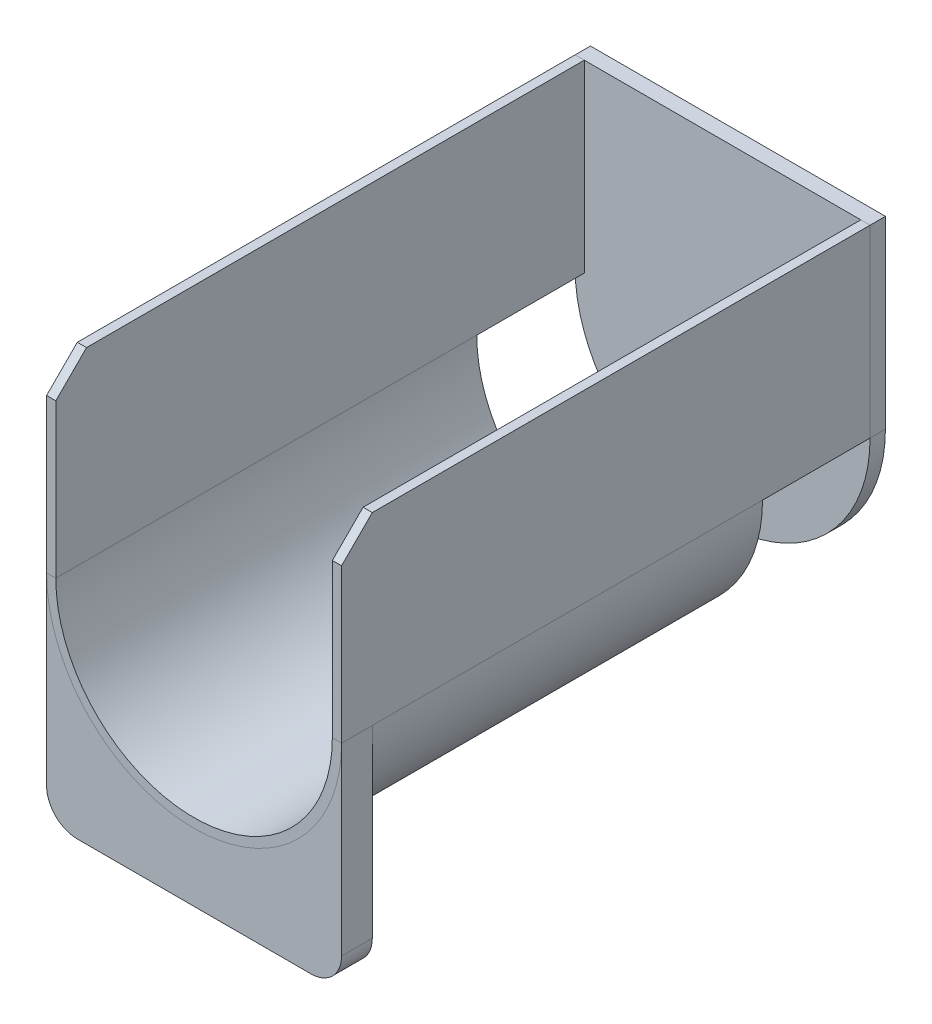
ISO-10303-21;
HEADER;
FILE_DESCRIPTION(('STEP AP214'),'2;1');
FILE_NAME('part.step','',(''),(''),'','','');
FILE_SCHEMA(('AUTOMOTIVE_DESIGN { 1 0 10303 214 1 1 1 1 }'));
ENDSEC;
DATA;
#1=APPLICATION_CONTEXT('core data for automotive mechanical design processes');
#2=APPLICATION_PROTOCOL_DEFINITION('international standard','automotive_design',2000,#1);
#3=PRODUCT_CONTEXT('',#1,'mechanical');
#4=PRODUCT('Part','Part','',(#3));
#5=PRODUCT_RELATED_PRODUCT_CATEGORY('part','',(#4));
#6=PRODUCT_DEFINITION_FORMATION('','',#4);
#7=PRODUCT_DEFINITION_CONTEXT('part definition',#1,'design');
#8=PRODUCT_DEFINITION('design','',#6,#7);
#9=PRODUCT_DEFINITION_SHAPE('','',#8);
#10=(LENGTH_UNIT() NAMED_UNIT(*) SI_UNIT(.MILLI.,.METRE.));
#11=(NAMED_UNIT(*) PLANE_ANGLE_UNIT() SI_UNIT($,.RADIAN.));
#12=(NAMED_UNIT(*) SI_UNIT($,.STERADIAN.) SOLID_ANGLE_UNIT());
#13=UNCERTAINTY_MEASURE_WITH_UNIT(LENGTH_MEASURE(1.E-05),#10,'distance_accuracy_value','');
#14=(GEOMETRIC_REPRESENTATION_CONTEXT(3) GLOBAL_UNCERTAINTY_ASSIGNED_CONTEXT((#13)) GLOBAL_UNIT_ASSIGNED_CONTEXT((#10,
#11,#12)) REPRESENTATION_CONTEXT('',''));
#15=CARTESIAN_POINT('',(0.,0.,0.));
#16=DIRECTION('',(0.,0.,1.));
#17=DIRECTION('',(1.,0.,0.));
#18=AXIS2_PLACEMENT_3D('',#15,#16,#17);
#19=CARTESIAN_POINT('',(0.,-70.,162.));
#20=DIRECTION('',(0.,-1.,0.));
#21=DIRECTION('',(0.,0.,-1.));
#22=AXIS2_PLACEMENT_3D('',#19,#20,#21);
#23=PLANE('',#22);
#24=DIRECTION('',(1.,0.,0.));
#25=VECTOR('',#24,1.);
#26=CARTESIAN_POINT('',(0.,-70.,162.));
#27=LINE('',#26,#25);
#28=CARTESIAN_POINT('',(-38.,-70.,162.));
#29=VERTEX_POINT('',#28);
#30=CARTESIAN_POINT('',(38.,-70.,162.));
#31=VERTEX_POINT('',#30);
#32=EDGE_CURVE('E111',#29,#31,#27,.T.);
#33=ORIENTED_EDGE('',*,*,#32,.T.);
#34=DIRECTION('',(0.,0.,1.));
#35=VECTOR('',#34,1.);
#36=CARTESIAN_POINT('',(38.,-70.,162.));
#37=LINE('',#36,#35);
#38=CARTESIAN_POINT('',(38.,-70.,172.));
#39=VERTEX_POINT('',#38);
#40=EDGE_CURVE('E129',#31,#39,#37,.T.);
#41=ORIENTED_EDGE('',*,*,#40,.T.);
#42=DIRECTION('',(1.,0.,0.));
#43=VECTOR('',#42,1.);
#44=CARTESIAN_POINT('',(0.,-70.,172.));
#45=LINE('',#44,#43);
#46=CARTESIAN_POINT('',(-38.,-70.,172.));
#47=VERTEX_POINT('',#46);
#48=EDGE_CURVE('E150',#47,#39,#45,.T.);
#49=ORIENTED_EDGE('',*,*,#48,.F.);
#50=DIRECTION('',(0.,0.,1.));
#51=VECTOR('',#50,1.);
#52=CARTESIAN_POINT('',(-38.,-70.,162.));
#53=LINE('',#52,#51);
#54=EDGE_CURVE('E123',#47,#29,#53,.F.);
#55=ORIENTED_EDGE('',*,*,#54,.T.);
#56=EDGE_LOOP('',(#33,#41,#49,#55));
#57=FACE_BOUND('',#56,.T.);
#58=ADVANCED_FACE('F49',(#57),#23,.T.);
#59=CARTESIAN_POINT('',(-48.,0.,162.));
#60=DIRECTION('',(-1.,0.,0.));
#61=DIRECTION('',(0.,-1.,0.));
#62=AXIS2_PLACEMENT_3D('',#59,#60,#61);
#63=PLANE('',#62);
#64=DIRECTION('',(0.,-1.,0.));
#65=VECTOR('',#64,1.);
#66=CARTESIAN_POINT('',(-48.,0.,162.));
#67=LINE('',#66,#65);
#68=CARTESIAN_POINT('',(-48.,0.,162.));
#69=VERTEX_POINT('',#68);
#70=CARTESIAN_POINT('',(-48.,-60.,162.));
#71=VERTEX_POINT('',#70);
#72=EDGE_CURVE('E115',#69,#71,#67,.T.);
#73=ORIENTED_EDGE('',*,*,#72,.T.);
#74=DIRECTION('',(0.,0.,1.));
#75=VECTOR('',#74,1.);
#76=CARTESIAN_POINT('',(-48.,-60.,162.));
#77=LINE('',#76,#75);
#78=CARTESIAN_POINT('',(-48.,-60.,172.));
#79=VERTEX_POINT('',#78);
#80=EDGE_CURVE('E12',#71,#79,#77,.T.);
#81=ORIENTED_EDGE('',*,*,#80,.T.);
#82=DIRECTION('',(0.,-1.,0.));
#83=VECTOR('',#82,1.);
#84=CARTESIAN_POINT('',(-48.,0.,172.));
#85=LINE('',#84,#83);
#86=CARTESIAN_POINT('',(-48.,0.,172.));
#87=VERTEX_POINT('',#86);
#88=EDGE_CURVE('E144',#87,#79,#85,.T.);
#89=ORIENTED_EDGE('',*,*,#88,.F.);
#90=DIRECTION('',(0.,0.,1.));
#91=VECTOR('',#90,1.);
#92=CARTESIAN_POINT('',(-48.,0.,162.));
#93=LINE('',#92,#91);
#94=EDGE_CURVE('E121',#69,#87,#93,.T.);
#95=ORIENTED_EDGE('',*,*,#94,.F.);
#96=EDGE_LOOP('',(#73,#81,#89,#95));
#97=FACE_BOUND('',#96,.T.);
#98=ADVANCED_FACE('F157',(#97),#63,.T.);
#99=CARTESIAN_POINT('',(0.,0.,162.));
#100=DIRECTION('',(0.,0.,1.));
#101=DIRECTION('',(1.,0.,0.));
#102=AXIS2_PLACEMENT_3D('',#99,#100,#101);
#103=CYLINDRICAL_SURFACE('',#102,48.);
#104=CARTESIAN_POINT('',(0.,0.,172.));
#105=DIRECTION('',(0.,0.,1.));
#106=DIRECTION('',(1.,0.,0.));
#107=AXIS2_PLACEMENT_3D('',#104,#105,#106);
#108=CIRCLE('',#107,48.);
#109=CARTESIAN_POINT('',(48.,0.,172.));
#110=VERTEX_POINT('',#109);
#111=EDGE_CURVE('E120',#87,#110,#108,.T.);
#112=ORIENTED_EDGE('',*,*,#111,.T.);
#113=DIRECTION('',(0.,0.,1.));
#114=VECTOR('',#113,1.);
#115=CARTESIAN_POINT('',(48.,0.,162.));
#116=LINE('',#115,#114);
#117=CARTESIAN_POINT('',(48.,0.,162.));
#118=VERTEX_POINT('',#117);
#119=EDGE_CURVE('E107',#118,#110,#116,.T.);
#120=ORIENTED_EDGE('',*,*,#119,.F.);
#121=CARTESIAN_POINT('',(0.,0.,162.));
#122=DIRECTION('',(0.,0.,1.));
#123=DIRECTION('',(1.,0.,0.));
#124=AXIS2_PLACEMENT_3D('',#121,#122,#123);
#125=CIRCLE('',#124,48.);
#126=EDGE_CURVE('E110',#69,#118,#125,.T.);
#127=ORIENTED_EDGE('',*,*,#126,.F.);
#128=ORIENTED_EDGE('',*,*,#94,.T.);
#129=EDGE_LOOP('',(#112,#120,#127,#128));
#130=FACE_BOUND('',#129,.T.);
#131=ADVANCED_FACE('F118',(#130),#103,.F.);
#132=CARTESIAN_POINT('',(48.,0.,162.));
#133=DIRECTION('',(1.,0.,0.));
#134=DIRECTION('',(0.,1.,0.));
#135=AXIS2_PLACEMENT_3D('',#132,#133,#134);
#136=PLANE('',#135);
#137=DIRECTION('',(0.,1.,0.));
#138=VECTOR('',#137,1.);
#139=CARTESIAN_POINT('',(48.,0.,172.));
#140=LINE('',#139,#138);
#141=CARTESIAN_POINT('',(48.,-60.,172.));
#142=VERTEX_POINT('',#141);
#143=EDGE_CURVE('E149',#142,#110,#140,.T.);
#144=ORIENTED_EDGE('',*,*,#143,.F.);
#145=DIRECTION('',(0.,0.,1.));
#146=VECTOR('',#145,1.);
#147=CARTESIAN_POINT('',(48.,-60.,162.));
#148=LINE('',#147,#146);
#149=CARTESIAN_POINT('',(48.,-60.,162.));
#150=VERTEX_POINT('',#149);
#151=EDGE_CURVE('E72',#142,#150,#148,.F.);
#152=ORIENTED_EDGE('',*,*,#151,.T.);
#153=DIRECTION('',(0.,1.,0.));
#154=VECTOR('',#153,1.);
#155=CARTESIAN_POINT('',(48.,0.,162.));
#156=LINE('',#155,#154);
#157=EDGE_CURVE('E103',#150,#118,#156,.T.);
#158=ORIENTED_EDGE('',*,*,#157,.T.);
#159=ORIENTED_EDGE('',*,*,#119,.T.);
#160=EDGE_LOOP('',(#144,#152,#158,#159));
#161=FACE_BOUND('',#160,.T.);
#162=ADVANCED_FACE('F105',(#161),#136,.T.);
#163=CARTESIAN_POINT('',(0.,0.,162.));
#164=DIRECTION('',(0.,0.,1.));
#165=DIRECTION('',(1.,0.,0.));
#166=AXIS2_PLACEMENT_3D('',#163,#164,#165);
#167=PLANE('',#166);
#168=ORIENTED_EDGE('',*,*,#157,.F.);
#169=CARTESIAN_POINT('',(38.,-60.,162.));
#170=DIRECTION('',(0.,0.,1.));
#171=DIRECTION('',(1.,0.,0.));
#172=AXIS2_PLACEMENT_3D('',#169,#170,#171);
#173=CIRCLE('',#172,10.);
#174=EDGE_CURVE('E57',#150,#31,#173,.F.);
#175=ORIENTED_EDGE('',*,*,#174,.T.);
#176=ORIENTED_EDGE('',*,*,#32,.F.);
#177=CARTESIAN_POINT('',(-38.,-60.,162.));
#178=DIRECTION('',(0.,0.,1.));
#179=DIRECTION('',(1.,0.,0.));
#180=AXIS2_PLACEMENT_3D('',#177,#178,#179);
#181=CIRCLE('',#180,10.);
#182=EDGE_CURVE('E64',#29,#71,#181,.F.);
#183=ORIENTED_EDGE('',*,*,#182,.T.);
#184=ORIENTED_EDGE('',*,*,#72,.F.);
#185=ORIENTED_EDGE('',*,*,#126,.T.);
#186=EDGE_LOOP('',(#168,#175,#176,#183,#184,#185));
#187=FACE_BOUND('',#186,.T.);
#188=ADVANCED_FACE('F114',(#187),#167,.F.);
#189=CARTESIAN_POINT('',(0.,0.,172.));
#190=DIRECTION('',(0.,0.,1.));
#191=DIRECTION('',(1.,0.,0.));
#192=AXIS2_PLACEMENT_3D('',#189,#190,#191);
#193=PLANE('',#192);
#194=ORIENTED_EDGE('',*,*,#48,.T.);
#195=CARTESIAN_POINT('',(38.,-60.,172.));
#196=DIRECTION('',(0.,0.,1.));
#197=DIRECTION('',(1.,0.,0.));
#198=AXIS2_PLACEMENT_3D('',#195,#196,#197);
#199=CIRCLE('',#198,10.);
#200=EDGE_CURVE('E134',#39,#142,#199,.T.);
#201=ORIENTED_EDGE('',*,*,#200,.T.);
#202=ORIENTED_EDGE('',*,*,#143,.T.);
#203=ORIENTED_EDGE('',*,*,#111,.F.);
#204=ORIENTED_EDGE('',*,*,#88,.T.);
#205=CARTESIAN_POINT('',(-38.,-60.,172.));
#206=DIRECTION('',(0.,0.,1.));
#207=DIRECTION('',(1.,0.,0.));
#208=AXIS2_PLACEMENT_3D('',#205,#206,#207);
#209=CIRCLE('',#208,10.);
#210=EDGE_CURVE('E132',#79,#47,#209,.T.);
#211=ORIENTED_EDGE('',*,*,#210,.T.);
#212=EDGE_LOOP('',(#194,#201,#202,#203,#204,#211));
#213=FACE_BOUND('',#212,.T.);
#214=ADVANCED_FACE('F148',(#213),#193,.T.);
#215=CARTESIAN_POINT('',(38.,-60.,162.));
#216=DIRECTION('',(0.,0.,1.));
#217=DIRECTION('',(1.,0.,0.));
#218=AXIS2_PLACEMENT_3D('',#215,#216,#217);
#219=CYLINDRICAL_SURFACE('',#218,10.);
#220=ORIENTED_EDGE('',*,*,#174,.F.);
#221=ORIENTED_EDGE('',*,*,#151,.F.);
#222=ORIENTED_EDGE('',*,*,#200,.F.);
#223=ORIENTED_EDGE('',*,*,#40,.F.);
#224=EDGE_LOOP('',(#220,#221,#222,#223));
#225=FACE_BOUND('',#224,.T.);
#226=ADVANCED_FACE('F146',(#225),#219,.T.);
#227=CARTESIAN_POINT('',(-38.,-60.,162.));
#228=DIRECTION('',(0.,0.,1.));
#229=DIRECTION('',(1.,0.,0.));
#230=AXIS2_PLACEMENT_3D('',#227,#228,#229);
#231=CYLINDRICAL_SURFACE('',#230,10.);
#232=ORIENTED_EDGE('',*,*,#182,.F.);
#233=ORIENTED_EDGE('',*,*,#54,.F.);
#234=ORIENTED_EDGE('',*,*,#210,.F.);
#235=ORIENTED_EDGE('',*,*,#80,.F.);
#236=EDGE_LOOP('',(#232,#233,#234,#235));
#237=FACE_BOUND('',#236,.T.);
#238=ADVANCED_FACE('F51',(#237),#231,.T.);
#239=CLOSED_SHELL('',(#58,#98,#131,#162,#188,#214,#226,#238));
#240=MANIFOLD_SOLID_BREP('B2',#239);
#241=CARTESIAN_POINT('',(48.,60.,-5.));
#242=DIRECTION('',(0.,-1.,0.));
#243=DIRECTION('',(0.,0.,-1.));
#244=AXIS2_PLACEMENT_3D('',#241,#242,#243);
#245=PLANE('',#244);
#246=DIRECTION('',(1.,0.,0.));
#247=VECTOR('',#246,1.);
#248=CARTESIAN_POINT('',(48.,60.,0.));
#249=LINE('',#248,#247);
#250=CARTESIAN_POINT('',(-48.,60.,0.));
#251=VERTEX_POINT('',#250);
#252=CARTESIAN_POINT('',(48.,60.,0.));
#253=VERTEX_POINT('',#252);
#254=EDGE_CURVE('E299',#251,#253,#249,.T.);
#255=ORIENTED_EDGE('',*,*,#254,.T.);
#256=DIRECTION('',(0.,0.,1.));
#257=VECTOR('',#256,1.);
#258=CARTESIAN_POINT('',(48.,60.,-5.));
#259=LINE('',#258,#257);
#260=CARTESIAN_POINT('',(48.,60.,-5.));
#261=VERTEX_POINT('',#260);
#262=EDGE_CURVE('E47',#261,#253,#259,.T.);
#263=ORIENTED_EDGE('',*,*,#262,.F.);
#264=DIRECTION('',(1.,0.,0.));
#265=VECTOR('',#264,1.);
#266=CARTESIAN_POINT('',(48.,60.,-5.));
#267=LINE('',#266,#265);
#268=CARTESIAN_POINT('',(-48.,60.,-5.));
#269=VERTEX_POINT('',#268);
#270=EDGE_CURVE('E287',#269,#261,#267,.T.);
#271=ORIENTED_EDGE('',*,*,#270,.F.);
#272=DIRECTION('',(0.,0.,1.));
#273=VECTOR('',#272,1.);
#274=CARTESIAN_POINT('',(-48.,60.,-5.));
#275=LINE('',#274,#273);
#276=EDGE_CURVE('E295',#269,#251,#275,.T.);
#277=ORIENTED_EDGE('',*,*,#276,.T.);
#278=EDGE_LOOP('',(#255,#263,#271,#277));
#279=FACE_BOUND('',#278,.T.);
#280=ADVANCED_FACE('F236',(#279),#245,.F.);
#281=CARTESIAN_POINT('',(48.,0.,-5.));
#282=DIRECTION('',(-1.,0.,0.));
#283=DIRECTION('',(0.,0.,1.));
#284=AXIS2_PLACEMENT_3D('',#281,#282,#283);
#285=PLANE('',#284);
#286=DIRECTION('',(0.,-1.,0.));
#287=VECTOR('',#286,1.);
#288=CARTESIAN_POINT('',(48.,0.,0.));
#289=LINE('',#288,#287);
#290=CARTESIAN_POINT('',(48.,0.,0.));
#291=VERTEX_POINT('',#290);
#292=EDGE_CURVE('E291',#253,#291,#289,.T.);
#293=ORIENTED_EDGE('',*,*,#292,.T.);
#294=DIRECTION('',(0.,0.,1.));
#295=VECTOR('',#294,1.);
#296=CARTESIAN_POINT('',(48.,0.,-5.));
#297=LINE('',#296,#295);
#298=CARTESIAN_POINT('',(48.,0.,-5.));
#299=VERTEX_POINT('',#298);
#300=EDGE_CURVE('E244',#299,#291,#297,.T.);
#301=ORIENTED_EDGE('',*,*,#300,.F.);
#302=DIRECTION('',(0.,-1.,0.));
#303=VECTOR('',#302,1.);
#304=CARTESIAN_POINT('',(48.,0.,-5.));
#305=LINE('',#304,#303);
#306=EDGE_CURVE('E282',#261,#299,#305,.T.);
#307=ORIENTED_EDGE('',*,*,#306,.F.);
#308=ORIENTED_EDGE('',*,*,#262,.T.);
#309=EDGE_LOOP('',(#293,#301,#307,#308));
#310=FACE_BOUND('',#309,.T.);
#311=ADVANCED_FACE('F290',(#310),#285,.F.);
#312=CARTESIAN_POINT('',(0.,0.,-5.));
#313=DIRECTION('',(0.,0.,1.));
#314=DIRECTION('',(1.,0.,0.));
#315=AXIS2_PLACEMENT_3D('',#312,#313,#314);
#316=CYLINDRICAL_SURFACE('',#315,48.);
#317=CARTESIAN_POINT('',(0.,0.,0.));
#318=DIRECTION('',(0.,0.,-1.));
#319=DIRECTION('',(-1.,0.,0.));
#320=AXIS2_PLACEMENT_3D('',#317,#318,#319);
#321=CIRCLE('',#320,48.);
#322=CARTESIAN_POINT('',(-48.,0.,0.));
#323=VERTEX_POINT('',#322);
#324=EDGE_CURVE('E269',#291,#323,#321,.T.);
#325=ORIENTED_EDGE('',*,*,#324,.T.);
#326=DIRECTION('',(0.,0.,1.));
#327=VECTOR('',#326,1.);
#328=CARTESIAN_POINT('',(-48.,0.,-5.));
#329=LINE('',#328,#327);
#330=CARTESIAN_POINT('',(-48.,0.,-5.));
#331=VERTEX_POINT('',#330);
#332=EDGE_CURVE('E292',#331,#323,#329,.T.);
#333=ORIENTED_EDGE('',*,*,#332,.F.);
#334=CARTESIAN_POINT('',(0.,0.,-5.));
#335=DIRECTION('',(0.,0.,-1.));
#336=DIRECTION('',(-1.,0.,0.));
#337=AXIS2_PLACEMENT_3D('',#334,#335,#336);
#338=CIRCLE('',#337,48.);
#339=EDGE_CURVE('E285',#299,#331,#338,.T.);
#340=ORIENTED_EDGE('',*,*,#339,.F.);
#341=ORIENTED_EDGE('',*,*,#300,.T.);
#342=EDGE_LOOP('',(#325,#333,#340,#341));
#343=FACE_BOUND('',#342,.T.);
#344=ADVANCED_FACE('F293',(#343),#316,.T.);
#345=CARTESIAN_POINT('',(-48.,60.,-5.));
#346=DIRECTION('',(1.,0.,0.));
#347=DIRECTION('',(0.,0.,-1.));
#348=AXIS2_PLACEMENT_3D('',#345,#346,#347);
#349=PLANE('',#348);
#350=DIRECTION('',(0.,1.,0.));
#351=VECTOR('',#350,1.);
#352=CARTESIAN_POINT('',(-48.,60.,0.));
#353=LINE('',#352,#351);
#354=EDGE_CURVE('E275',#323,#251,#353,.T.);
#355=ORIENTED_EDGE('',*,*,#354,.T.);
#356=ORIENTED_EDGE('',*,*,#276,.F.);
#357=DIRECTION('',(0.,1.,0.));
#358=VECTOR('',#357,1.);
#359=CARTESIAN_POINT('',(-48.,60.,-5.));
#360=LINE('',#359,#358);
#361=EDGE_CURVE('E252',#331,#269,#360,.T.);
#362=ORIENTED_EDGE('',*,*,#361,.F.);
#363=ORIENTED_EDGE('',*,*,#332,.T.);
#364=EDGE_LOOP('',(#355,#356,#362,#363));
#365=FACE_BOUND('',#364,.T.);
#366=ADVANCED_FACE('F306',(#365),#349,.F.);
#367=CARTESIAN_POINT('',(0.,0.,-5.));
#368=DIRECTION('',(0.,0.,-1.));
#369=DIRECTION('',(-1.,0.,0.));
#370=AXIS2_PLACEMENT_3D('',#367,#368,#369);
#371=PLANE('',#370);
#372=ORIENTED_EDGE('',*,*,#270,.T.);
#373=ORIENTED_EDGE('',*,*,#306,.T.);
#374=ORIENTED_EDGE('',*,*,#339,.T.);
#375=ORIENTED_EDGE('',*,*,#361,.T.);
#376=EDGE_LOOP('',(#372,#373,#374,#375));
#377=FACE_BOUND('',#376,.T.);
#378=ADVANCED_FACE('F283',(#377),#371,.T.);
#379=CARTESIAN_POINT('',(0.,0.,0.));
#380=DIRECTION('',(0.,0.,-1.));
#381=DIRECTION('',(-1.,0.,0.));
#382=AXIS2_PLACEMENT_3D('',#379,#380,#381);
#383=PLANE('',#382);
#384=ORIENTED_EDGE('',*,*,#254,.F.);
#385=ORIENTED_EDGE('',*,*,#354,.F.);
#386=ORIENTED_EDGE('',*,*,#324,.F.);
#387=ORIENTED_EDGE('',*,*,#292,.F.);
#388=EDGE_LOOP('',(#384,#385,#386,#387));
#389=FACE_BOUND('',#388,.T.);
#390=ADVANCED_FACE('F309',(#389),#383,.F.);
#391=CLOSED_SHELL('',(#280,#311,#344,#366,#378,#390));
#392=MANIFOLD_SOLID_BREP('B6',#391);
#393=CARTESIAN_POINT('',(45.,0.,172.));
#394=DIRECTION('',(0.,0.,1.));
#395=DIRECTION('',(1.,0.,0.));
#396=AXIS2_PLACEMENT_3D('',#393,#394,#395);
#397=PLANE('',#396);
#398=DIRECTION('',(1.,0.,0.));
#399=VECTOR('',#398,1.);
#400=CARTESIAN_POINT('',(45.,0.,172.));
#401=LINE('',#400,#399);
#402=CARTESIAN_POINT('',(45.,0.,172.));
#403=VERTEX_POINT('',#402);
#404=CARTESIAN_POINT('',(48.,0.,172.));
#405=VERTEX_POINT('',#404);
#406=EDGE_CURVE('E480',#403,#405,#401,.T.);
#407=ORIENTED_EDGE('',*,*,#406,.F.);
#408=CARTESIAN_POINT('',(0.,0.,172.));
#409=DIRECTION('',(0.,0.,1.));
#410=DIRECTION('',(1.,0.,0.));
#411=AXIS2_PLACEMENT_3D('',#408,#409,#410);
#412=CIRCLE('',#411,45.);
#413=CARTESIAN_POINT('',(-45.,0.,172.));
#414=VERTEX_POINT('',#413);
#415=EDGE_CURVE('E560',#414,#403,#412,.T.);
#416=ORIENTED_EDGE('',*,*,#415,.F.);
#417=DIRECTION('',(1.,0.,0.));
#418=VECTOR('',#417,1.);
#419=CARTESIAN_POINT('',(-48.,0.,172.));
#420=LINE('',#419,#418);
#421=CARTESIAN_POINT('',(-48.,0.,172.));
#422=VERTEX_POINT('',#421);
#423=EDGE_CURVE('E514',#422,#414,#420,.T.);
#424=ORIENTED_EDGE('',*,*,#423,.F.);
#425=CARTESIAN_POINT('',(0.,0.,172.));
#426=DIRECTION('',(0.,0.,1.));
#427=DIRECTION('',(1.,0.,0.));
#428=AXIS2_PLACEMENT_3D('',#425,#426,#427);
#429=CIRCLE('',#428,48.);
#430=EDGE_CURVE('E486',#422,#405,#429,.T.);
#431=ORIENTED_EDGE('',*,*,#430,.T.);
#432=EDGE_LOOP('',(#407,#416,#424,#431));
#433=FACE_BOUND('',#432,.T.);
#434=ADVANCED_FACE('F359',(#433),#397,.T.);
#435=CARTESIAN_POINT('',(-48.,0.,172.));
#436=DIRECTION('',(0.,0.,1.));
#437=DIRECTION('',(1.,0.,0.));
#438=AXIS2_PLACEMENT_3D('',#435,#436,#437);
#439=PLANE('',#438);
#440=DIRECTION('',(0.,1.,0.));
#441=VECTOR('',#440,1.);
#442=CARTESIAN_POINT('',(48.,0.,172.));
#443=LINE('',#442,#441);
#444=CARTESIAN_POINT('',(48.,50.,172.));
#445=VERTEX_POINT('',#444);
#446=EDGE_CURVE('E485',#405,#445,#443,.T.);
#447=ORIENTED_EDGE('',*,*,#446,.T.);
#448=DIRECTION('',(-1.,0.,0.));
#449=VECTOR('',#448,1.);
#450=CARTESIAN_POINT('',(-48.,50.,172.));
#451=LINE('',#450,#449);
#452=CARTESIAN_POINT('',(45.,50.,172.));
#453=VERTEX_POINT('',#452);
#454=EDGE_CURVE('E522',#445,#453,#451,.T.);
#455=ORIENTED_EDGE('',*,*,#454,.T.);
#456=DIRECTION('',(0.,1.,0.));
#457=VECTOR('',#456,1.);
#458=CARTESIAN_POINT('',(45.,0.,172.));
#459=LINE('',#458,#457);
#460=EDGE_CURVE('E563',#403,#453,#459,.T.);
#461=ORIENTED_EDGE('',*,*,#460,.F.);
#462=ORIENTED_EDGE('',*,*,#406,.T.);
#463=EDGE_LOOP('',(#447,#455,#461,#462));
#464=FACE_BOUND('',#463,.T.);
#465=ADVANCED_FACE('F583',(#464),#439,.T.);
#466=CARTESIAN_POINT('',(48.,0.,0.));
#467=DIRECTION('',(0.,0.,-1.));
#468=DIRECTION('',(-1.,0.,0.));
#469=AXIS2_PLACEMENT_3D('',#466,#467,#468);
#470=PLANE('',#469);
#471=DIRECTION('',(0.,-1.,0.));
#472=VECTOR('',#471,1.);
#473=CARTESIAN_POINT('',(-45.,0.,0.));
#474=LINE('',#473,#472);
#475=CARTESIAN_POINT('',(-45.,60.,0.));
#476=VERTEX_POINT('',#475);
#477=CARTESIAN_POINT('',(-45.,0.,0.));
#478=VERTEX_POINT('',#477);
#479=EDGE_CURVE('E540',#476,#478,#474,.T.);
#480=ORIENTED_EDGE('',*,*,#479,.T.);
#481=DIRECTION('',(-1.,0.,0.));
#482=VECTOR('',#481,1.);
#483=CARTESIAN_POINT('',(-45.,0.,0.));
#484=LINE('',#483,#482);
#485=CARTESIAN_POINT('',(-48.,0.,0.));
#486=VERTEX_POINT('',#485);
#487=EDGE_CURVE('E511',#478,#486,#484,.T.);
#488=ORIENTED_EDGE('',*,*,#487,.T.);
#489=DIRECTION('',(0.,1.,0.));
#490=VECTOR('',#489,1.);
#491=CARTESIAN_POINT('',(-48.,0.,0.));
#492=LINE('',#491,#490);
#493=CARTESIAN_POINT('',(-48.,60.,0.));
#494=VERTEX_POINT('',#493);
#495=EDGE_CURVE('E494',#494,#486,#492,.F.);
#496=ORIENTED_EDGE('',*,*,#495,.F.);
#497=DIRECTION('',(1.,0.,0.));
#498=VECTOR('',#497,1.);
#499=CARTESIAN_POINT('',(-48.,60.,0.));
#500=LINE('',#499,#498);
#501=EDGE_CURVE('E543',#494,#476,#500,.T.);
#502=ORIENTED_EDGE('',*,*,#501,.T.);
#503=EDGE_LOOP('',(#480,#488,#496,#502));
#504=FACE_BOUND('',#503,.T.);
#505=ADVANCED_FACE('F547',(#504),#470,.T.);
#506=CARTESIAN_POINT('',(48.,0.,172.));
#507=DIRECTION('',(-1.,0.,0.));
#508=DIRECTION('',(0.,0.,1.));
#509=AXIS2_PLACEMENT_3D('',#506,#507,#508);
#510=PLANE('',#509);
#511=DIRECTION('',(0.,0.,-1.));
#512=VECTOR('',#511,1.);
#513=CARTESIAN_POINT('',(48.,60.,172.));
#514=LINE('',#513,#512);
#515=CARTESIAN_POINT('',(48.,60.,162.));
#516=VERTEX_POINT('',#515);
#517=CARTESIAN_POINT('',(48.,60.,0.));
#518=VERTEX_POINT('',#517);
#519=EDGE_CURVE('E508',#516,#518,#514,.T.);
#520=ORIENTED_EDGE('',*,*,#519,.F.);
#521=DIRECTION('',(0.,0.707106781186549,-0.707106781186547));
#522=VECTOR('',#521,1.);
#523=CARTESIAN_POINT('',(48.,60.,162.));
#524=LINE('',#523,#522);
#525=EDGE_CURVE('E520',#516,#445,#524,.F.);
#526=ORIENTED_EDGE('',*,*,#525,.T.);
#527=ORIENTED_EDGE('',*,*,#446,.F.);
#528=DIRECTION('',(0.,0.,-1.));
#529=VECTOR('',#528,1.);
#530=CARTESIAN_POINT('',(48.,0.,172.));
#531=LINE('',#530,#529);
#532=CARTESIAN_POINT('',(48.,0.,35.));
#533=VERTEX_POINT('',#532);
#534=EDGE_CURVE('E475',#405,#533,#531,.T.);
#535=ORIENTED_EDGE('',*,*,#534,.T.);
#536=DIRECTION('',(0.,0.,-1.));
#537=VECTOR('',#536,1.);
#538=CARTESIAN_POINT('',(48.,0.,0.));
#539=LINE('',#538,#537);
#540=CARTESIAN_POINT('',(48.,0.,0.));
#541=VERTEX_POINT('',#540);
#542=EDGE_CURVE('E460',#533,#541,#539,.T.);
#543=ORIENTED_EDGE('',*,*,#542,.T.);
#544=DIRECTION('',(0.,1.,0.));
#545=VECTOR('',#544,1.);
#546=CARTESIAN_POINT('',(48.,0.,0.));
#547=LINE('',#546,#545);
#548=EDGE_CURVE('E555',#541,#518,#547,.T.);
#549=ORIENTED_EDGE('',*,*,#548,.T.);
#550=EDGE_LOOP('',(#520,#526,#527,#535,#543,#549));
#551=FACE_BOUND('',#550,.T.);
#552=ADVANCED_FACE('F483',(#551),#510,.F.);
#553=CARTESIAN_POINT('',(45.,60.,172.));
#554=DIRECTION('',(0.,1.,0.));
#555=DIRECTION('',(0.,0.,1.));
#556=AXIS2_PLACEMENT_3D('',#553,#554,#555);
#557=PLANE('',#556);
#558=DIRECTION('',(0.,0.,-1.));
#559=VECTOR('',#558,1.);
#560=CARTESIAN_POINT('',(45.,60.,172.));
#561=LINE('',#560,#559);
#562=CARTESIAN_POINT('',(45.,60.,162.));
#563=VERTEX_POINT('',#562);
#564=CARTESIAN_POINT('',(45.,60.,0.));
#565=VERTEX_POINT('',#564);
#566=EDGE_CURVE('E506',#563,#565,#561,.T.);
#567=ORIENTED_EDGE('',*,*,#566,.F.);
#568=DIRECTION('',(1.,0.,0.));
#569=VECTOR('',#568,1.);
#570=CARTESIAN_POINT('',(45.,60.,162.));
#571=LINE('',#570,#569);
#572=EDGE_CURVE('E479',#563,#516,#571,.T.);
#573=ORIENTED_EDGE('',*,*,#572,.T.);
#574=ORIENTED_EDGE('',*,*,#519,.T.);
#575=DIRECTION('',(1.,0.,0.));
#576=VECTOR('',#575,1.);
#577=CARTESIAN_POINT('',(45.,60.,0.));
#578=LINE('',#577,#576);
#579=EDGE_CURVE('E552',#565,#518,#578,.T.);
#580=ORIENTED_EDGE('',*,*,#579,.F.);
#581=EDGE_LOOP('',(#567,#573,#574,#580));
#582=FACE_BOUND('',#581,.T.);
#583=ADVANCED_FACE('F596',(#582),#557,.T.);
#584=CARTESIAN_POINT('',(45.,0.,172.));
#585=DIRECTION('',(-1.,0.,0.));
#586=DIRECTION('',(0.,0.,1.));
#587=AXIS2_PLACEMENT_3D('',#584,#585,#586);
#588=PLANE('',#587);
#589=ORIENTED_EDGE('',*,*,#460,.T.);
#590=DIRECTION('',(0.,-0.707106781186549,0.707106781186547));
#591=VECTOR('',#590,1.);
#592=CARTESIAN_POINT('',(45.,24.9999999999999,197.));
#593=LINE('',#592,#591);
#594=EDGE_CURVE('E524',#453,#563,#593,.F.);
#595=ORIENTED_EDGE('',*,*,#594,.T.);
#596=ORIENTED_EDGE('',*,*,#566,.T.);
#597=DIRECTION('',(0.,1.,0.));
#598=VECTOR('',#597,1.);
#599=CARTESIAN_POINT('',(45.,0.,0.));
#600=LINE('',#599,#598);
#601=CARTESIAN_POINT('',(45.,0.,0.));
#602=VERTEX_POINT('',#601);
#603=EDGE_CURVE('E544',#602,#565,#600,.T.);
#604=ORIENTED_EDGE('',*,*,#603,.F.);
#605=DIRECTION('',(0.,0.,-1.));
#606=VECTOR('',#605,1.);
#607=CARTESIAN_POINT('',(45.,0.,172.));
#608=LINE('',#607,#606);
#609=CARTESIAN_POINT('',(45.,0.,35.));
#610=VERTEX_POINT('',#609);
#611=EDGE_CURVE('E568',#610,#602,#608,.T.);
#612=ORIENTED_EDGE('',*,*,#611,.F.);
#613=DIRECTION('',(0.,0.,-1.));
#614=VECTOR('',#613,1.);
#615=CARTESIAN_POINT('',(45.,0.,172.));
#616=LINE('',#615,#614);
#617=EDGE_CURVE('E503',#403,#610,#616,.T.);
#618=ORIENTED_EDGE('',*,*,#617,.F.);
#619=EDGE_LOOP('',(#589,#595,#596,#604,#612,#618));
#620=FACE_BOUND('',#619,.T.);
#621=ADVANCED_FACE('F599',(#620),#588,.T.);
#622=CARTESIAN_POINT('',(0.,0.,172.));
#623=DIRECTION('',(0.,0.,-1.));
#624=DIRECTION('',(-1.,0.,0.));
#625=AXIS2_PLACEMENT_3D('',#622,#623,#624);
#626=CYLINDRICAL_SURFACE('',#625,45.);
#627=CARTESIAN_POINT('',(0.,0.,35.));
#628=DIRECTION('',(0.,0.,1.));
#629=DIRECTION('',(1.,0.,0.));
#630=AXIS2_PLACEMENT_3D('',#627,#628,#629);
#631=CIRCLE('',#630,45.);
#632=CARTESIAN_POINT('',(-45.,0.,35.));
#633=VERTEX_POINT('',#632);
#634=EDGE_CURVE('E453',#633,#610,#631,.T.);
#635=ORIENTED_EDGE('',*,*,#634,.F.);
#636=DIRECTION('',(0.,0.,-1.));
#637=VECTOR('',#636,1.);
#638=CARTESIAN_POINT('',(-45.,0.,172.));
#639=LINE('',#638,#637);
#640=EDGE_CURVE('E500',#414,#633,#639,.T.);
#641=ORIENTED_EDGE('',*,*,#640,.F.);
#642=ORIENTED_EDGE('',*,*,#415,.T.);
#643=ORIENTED_EDGE('',*,*,#617,.T.);
#644=EDGE_LOOP('',(#635,#641,#642,#643));
#645=FACE_BOUND('',#644,.T.);
#646=ADVANCED_FACE('F603',(#645),#626,.F.);
#647=CARTESIAN_POINT('',(-45.,0.,172.));
#648=DIRECTION('',(1.,0.,0.));
#649=DIRECTION('',(0.,0.,-1.));
#650=AXIS2_PLACEMENT_3D('',#647,#648,#649);
#651=PLANE('',#650);
#652=DIRECTION('',(0.,0.,-1.));
#653=VECTOR('',#652,1.);
#654=CARTESIAN_POINT('',(-45.,60.,172.));
#655=LINE('',#654,#653);
#656=CARTESIAN_POINT('',(-45.,60.,162.));
#657=VERTEX_POINT('',#656);
#658=EDGE_CURVE('E498',#657,#476,#655,.T.);
#659=ORIENTED_EDGE('',*,*,#658,.F.);
#660=DIRECTION('',(0.,0.707106781186549,-0.707106781186547));
#661=VECTOR('',#660,1.);
#662=CARTESIAN_POINT('',(-45.,24.9999999999999,197.));
#663=LINE('',#662,#661);
#664=CARTESIAN_POINT('',(-45.,50.,172.));
#665=VERTEX_POINT('',#664);
#666=EDGE_CURVE('E381',#657,#665,#663,.F.);
#667=ORIENTED_EDGE('',*,*,#666,.T.);
#668=DIRECTION('',(0.,-1.,0.));
#669=VECTOR('',#668,1.);
#670=CARTESIAN_POINT('',(-45.,0.,172.));
#671=LINE('',#670,#669);
#672=EDGE_CURVE('E558',#665,#414,#671,.T.);
#673=ORIENTED_EDGE('',*,*,#672,.T.);
#674=ORIENTED_EDGE('',*,*,#640,.T.);
#675=DIRECTION('',(0.,0.,1.));
#676=VECTOR('',#675,1.);
#677=CARTESIAN_POINT('',(-45.,0.,172.));
#678=LINE('',#677,#676);
#679=EDGE_CURVE('E456',#478,#633,#678,.T.);
#680=ORIENTED_EDGE('',*,*,#679,.F.);
#681=ORIENTED_EDGE('',*,*,#479,.F.);
#682=EDGE_LOOP('',(#659,#667,#673,#674,#680,#681));
#683=FACE_BOUND('',#682,.T.);
#684=ADVANCED_FACE('F537',(#683),#651,.T.);
#685=CARTESIAN_POINT('',(-48.,60.,172.));
#686=DIRECTION('',(0.,1.,0.));
#687=DIRECTION('',(0.,0.,1.));
#688=AXIS2_PLACEMENT_3D('',#685,#686,#687);
#689=PLANE('',#688);
#690=DIRECTION('',(0.,0.,-1.));
#691=VECTOR('',#690,1.);
#692=CARTESIAN_POINT('',(-48.,60.,172.));
#693=LINE('',#692,#691);
#694=CARTESIAN_POINT('',(-48.,60.,162.));
#695=VERTEX_POINT('',#694);
#696=EDGE_CURVE('E488',#695,#494,#693,.T.);
#697=ORIENTED_EDGE('',*,*,#696,.F.);
#698=DIRECTION('',(1.,0.,0.));
#699=VECTOR('',#698,1.);
#700=CARTESIAN_POINT('',(-48.,60.,162.));
#701=LINE('',#700,#699);
#702=EDGE_CURVE('E526',#695,#657,#701,.T.);
#703=ORIENTED_EDGE('',*,*,#702,.T.);
#704=ORIENTED_EDGE('',*,*,#658,.T.);
#705=ORIENTED_EDGE('',*,*,#501,.F.);
#706=EDGE_LOOP('',(#697,#703,#704,#705));
#707=FACE_BOUND('',#706,.T.);
#708=ADVANCED_FACE('F532',(#707),#689,.T.);
#709=CARTESIAN_POINT('',(-48.,0.,172.));
#710=DIRECTION('',(1.,0.,0.));
#711=DIRECTION('',(0.,0.,-1.));
#712=AXIS2_PLACEMENT_3D('',#709,#710,#711);
#713=PLANE('',#712);
#714=DIRECTION('',(0.,1.,0.));
#715=VECTOR('',#714,1.);
#716=CARTESIAN_POINT('',(-48.,0.,172.));
#717=LINE('',#716,#715);
#718=CARTESIAN_POINT('',(-48.,50.,172.));
#719=VERTEX_POINT('',#718);
#720=EDGE_CURVE('E491',#719,#422,#717,.F.);
#721=ORIENTED_EDGE('',*,*,#720,.F.);
#722=DIRECTION('',(0.,-0.707106781186549,0.707106781186547));
#723=VECTOR('',#722,1.);
#724=CARTESIAN_POINT('',(-48.,60.,162.));
#725=LINE('',#724,#723);
#726=EDGE_CURVE('E234',#719,#695,#725,.F.);
#727=ORIENTED_EDGE('',*,*,#726,.T.);
#728=ORIENTED_EDGE('',*,*,#696,.T.);
#729=ORIENTED_EDGE('',*,*,#495,.T.);
#730=DIRECTION('',(0.,0.,-1.));
#731=VECTOR('',#730,1.);
#732=CARTESIAN_POINT('',(-48.,0.,0.));
#733=LINE('',#732,#731);
#734=CARTESIAN_POINT('',(-48.,0.,35.));
#735=VERTEX_POINT('',#734);
#736=EDGE_CURVE('E468',#735,#486,#733,.T.);
#737=ORIENTED_EDGE('',*,*,#736,.F.);
#738=DIRECTION('',(0.,0.,-1.));
#739=VECTOR('',#738,1.);
#740=CARTESIAN_POINT('',(-48.,0.,172.));
#741=LINE('',#740,#739);
#742=EDGE_CURVE('E478',#422,#735,#741,.T.);
#743=ORIENTED_EDGE('',*,*,#742,.F.);
#744=EDGE_LOOP('',(#721,#727,#728,#729,#737,#743));
#745=FACE_BOUND('',#744,.T.);
#746=ADVANCED_FACE('F575',(#745),#713,.F.);
#747=CARTESIAN_POINT('',(0.,0.,172.));
#748=DIRECTION('',(0.,0.,-1.));
#749=DIRECTION('',(-1.,0.,0.));
#750=AXIS2_PLACEMENT_3D('',#747,#748,#749);
#751=CYLINDRICAL_SURFACE('',#750,48.);
#752=ORIENTED_EDGE('',*,*,#742,.T.);
#753=CARTESIAN_POINT('',(0.,0.,35.));
#754=DIRECTION('',(0.,0.,1.));
#755=DIRECTION('',(1.,0.,0.));
#756=AXIS2_PLACEMENT_3D('',#753,#754,#755);
#757=CIRCLE('',#756,48.);
#758=EDGE_CURVE('E450',#735,#533,#757,.T.);
#759=ORIENTED_EDGE('',*,*,#758,.T.);
#760=ORIENTED_EDGE('',*,*,#534,.F.);
#761=ORIENTED_EDGE('',*,*,#430,.F.);
#762=EDGE_LOOP('',(#752,#759,#760,#761));
#763=FACE_BOUND('',#762,.T.);
#764=ADVANCED_FACE('F473',(#763),#751,.T.);
#765=CARTESIAN_POINT('',(0.,0.,172.));
#766=DIRECTION('',(0.,0.,1.));
#767=DIRECTION('',(1.,0.,0.));
#768=AXIS2_PLACEMENT_3D('',#765,#766,#767);
#769=PLANE('',#768);
#770=ORIENTED_EDGE('',*,*,#672,.F.);
#771=DIRECTION('',(-1.,0.,0.));
#772=VECTOR('',#771,1.);
#773=CARTESIAN_POINT('',(0.,50.,172.));
#774=LINE('',#773,#772);
#775=EDGE_CURVE('E367',#665,#719,#774,.T.);
#776=ORIENTED_EDGE('',*,*,#775,.T.);
#777=ORIENTED_EDGE('',*,*,#720,.T.);
#778=ORIENTED_EDGE('',*,*,#423,.T.);
#779=EDGE_LOOP('',(#770,#776,#777,#778));
#780=FACE_BOUND('',#779,.T.);
#781=ADVANCED_FACE('F616',(#780),#769,.T.);
#782=CARTESIAN_POINT('',(0.,0.,0.));
#783=DIRECTION('',(0.,0.,1.));
#784=DIRECTION('',(1.,0.,0.));
#785=AXIS2_PLACEMENT_3D('',#782,#783,#784);
#786=PLANE('',#785);
#787=ORIENTED_EDGE('',*,*,#548,.F.);
#788=DIRECTION('',(-1.,0.,0.));
#789=VECTOR('',#788,1.);
#790=CARTESIAN_POINT('',(48.,0.,0.));
#791=LINE('',#790,#789);
#792=EDGE_CURVE('E463',#541,#602,#791,.T.);
#793=ORIENTED_EDGE('',*,*,#792,.T.);
#794=ORIENTED_EDGE('',*,*,#603,.T.);
#795=ORIENTED_EDGE('',*,*,#579,.T.);
#796=EDGE_LOOP('',(#787,#793,#794,#795));
#797=FACE_BOUND('',#796,.T.);
#798=ADVANCED_FACE('F617',(#797),#786,.F.);
#799=CARTESIAN_POINT('',(48.,0.,35.));
#800=DIRECTION('',(0.,0.,1.));
#801=DIRECTION('',(1.,0.,0.));
#802=AXIS2_PLACEMENT_3D('',#799,#800,#801);
#803=PLANE('',#802);
#804=ORIENTED_EDGE('',*,*,#634,.T.);
#805=DIRECTION('',(-1.,0.,0.));
#806=VECTOR('',#805,1.);
#807=CARTESIAN_POINT('',(48.,0.,35.));
#808=LINE('',#807,#806);
#809=EDGE_CURVE('E445',#533,#610,#808,.T.);
#810=ORIENTED_EDGE('',*,*,#809,.F.);
#811=ORIENTED_EDGE('',*,*,#758,.F.);
#812=EDGE_CURVE('E457',#633,#735,#808,.T.);
#813=ORIENTED_EDGE('',*,*,#812,.F.);
#814=EDGE_LOOP('',(#804,#810,#811,#813));
#815=FACE_BOUND('',#814,.T.);
#816=ADVANCED_FACE('F447',(#815),#803,.F.);
#817=CARTESIAN_POINT('',(48.,0.,0.));
#818=DIRECTION('',(0.,1.,0.));
#819=DIRECTION('',(0.,0.,1.));
#820=AXIS2_PLACEMENT_3D('',#817,#818,#819);
#821=PLANE('',#820);
#822=ORIENTED_EDGE('',*,*,#611,.T.);
#823=ORIENTED_EDGE('',*,*,#792,.F.);
#824=ORIENTED_EDGE('',*,*,#542,.F.);
#825=ORIENTED_EDGE('',*,*,#809,.T.);
#826=EDGE_LOOP('',(#822,#823,#824,#825));
#827=FACE_BOUND('',#826,.T.);
#828=ADVANCED_FACE('F461',(#827),#821,.F.);
#829=ORIENTED_EDGE('',*,*,#679,.T.);
#830=ORIENTED_EDGE('',*,*,#812,.T.);
#831=ORIENTED_EDGE('',*,*,#736,.T.);
#832=ORIENTED_EDGE('',*,*,#487,.F.);
#833=EDGE_LOOP('',(#829,#830,#831,#832));
#834=FACE_BOUND('',#833,.T.);
#835=ADVANCED_FACE('F573',(#834),#821,.F.);
#836=CARTESIAN_POINT('',(45.,60.,162.));
#837=DIRECTION('',(0.,-0.707106781186546,-0.707106781186548));
#838=DIRECTION('',(1.,0.,0.));
#839=AXIS2_PLACEMENT_3D('',#836,#837,#838);
#840=PLANE('',#839);
#841=ORIENTED_EDGE('',*,*,#594,.F.);
#842=ORIENTED_EDGE('',*,*,#454,.F.);
#843=ORIENTED_EDGE('',*,*,#525,.F.);
#844=ORIENTED_EDGE('',*,*,#572,.F.);
#845=EDGE_LOOP('',(#841,#842,#843,#844));
#846=FACE_BOUND('',#845,.T.);
#847=ADVANCED_FACE('F577',(#846),#840,.F.);
#848=CARTESIAN_POINT('',(-48.,60.,162.));
#849=DIRECTION('',(0.,-0.707106781186546,-0.707106781186548));
#850=DIRECTION('',(1.,0.,0.));
#851=AXIS2_PLACEMENT_3D('',#848,#849,#850);
#852=PLANE('',#851);
#853=ORIENTED_EDGE('',*,*,#726,.F.);
#854=ORIENTED_EDGE('',*,*,#775,.F.);
#855=ORIENTED_EDGE('',*,*,#666,.F.);
#856=ORIENTED_EDGE('',*,*,#702,.F.);
#857=EDGE_LOOP('',(#853,#854,#855,#856));
#858=FACE_BOUND('',#857,.T.);
#859=ADVANCED_FACE('F361',(#858),#852,.F.);
#860=CLOSED_SHELL('',(#434,#465,#505,#552,#583,#621,#646,#684,#708,#746,#764,#781,#798,#816,
#828,#835,#847,#859));
#861=MANIFOLD_SOLID_BREP('B41',#860);
#862=ADVANCED_BREP_SHAPE_REPRESENTATION('',(#18,#240,#392,#861),#14);
#863=SHAPE_DEFINITION_REPRESENTATION(#9,#862);
ENDSEC;
END-ISO-10303-21;
